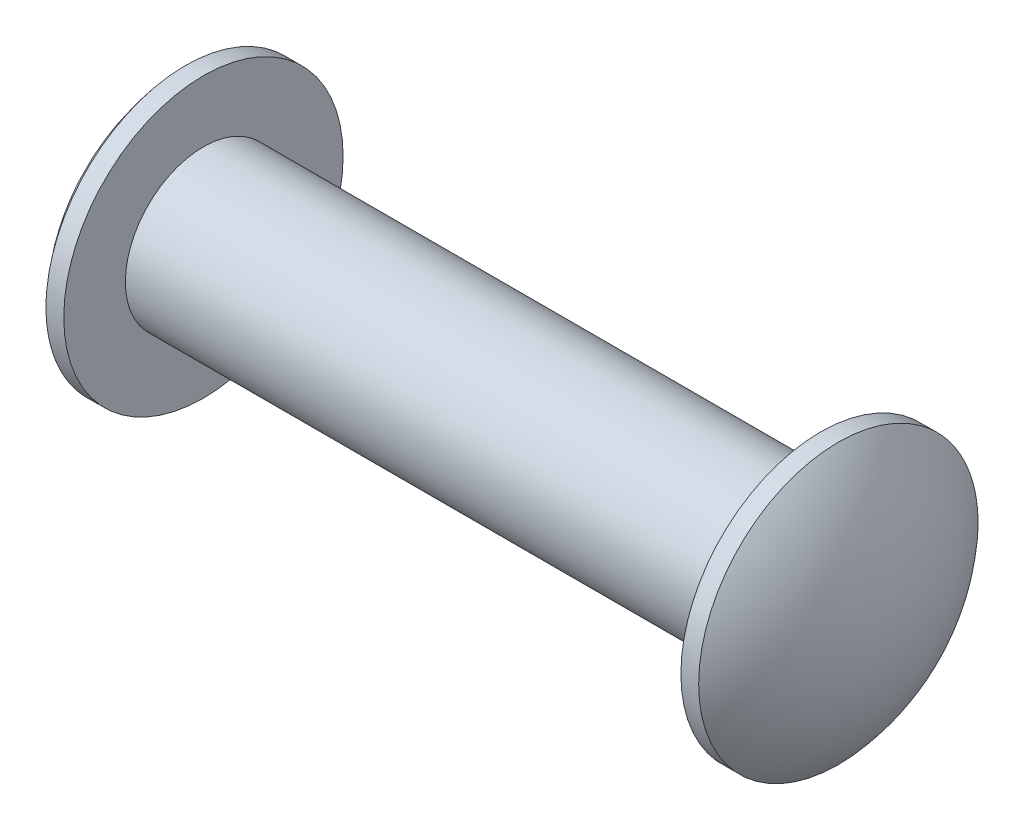
ISO-10303-21;
HEADER;
FILE_DESCRIPTION(('STEP AP214'),'2;1');
FILE_NAME('part.step','',(''),(''),'','','');
FILE_SCHEMA(('AUTOMOTIVE_DESIGN { 1 0 10303 214 1 1 1 1 }'));
ENDSEC;
DATA;
#1=APPLICATION_CONTEXT('core data for automotive mechanical design processes');
#2=APPLICATION_PROTOCOL_DEFINITION('international standard','automotive_design',2000,#1);
#3=PRODUCT_CONTEXT('',#1,'mechanical');
#4=PRODUCT('Part','Part','',(#3));
#5=PRODUCT_RELATED_PRODUCT_CATEGORY('part','',(#4));
#6=PRODUCT_DEFINITION_FORMATION('','',#4);
#7=PRODUCT_DEFINITION_CONTEXT('part definition',#1,'design');
#8=PRODUCT_DEFINITION('design','',#6,#7);
#9=PRODUCT_DEFINITION_SHAPE('','',#8);
#10=(LENGTH_UNIT() NAMED_UNIT(*) SI_UNIT(.MILLI.,.METRE.));
#11=(NAMED_UNIT(*) PLANE_ANGLE_UNIT() SI_UNIT($,.RADIAN.));
#12=(NAMED_UNIT(*) SI_UNIT($,.STERADIAN.) SOLID_ANGLE_UNIT());
#13=UNCERTAINTY_MEASURE_WITH_UNIT(LENGTH_MEASURE(1.E-05),#10,'distance_accuracy_value','');
#14=(GEOMETRIC_REPRESENTATION_CONTEXT(3) GLOBAL_UNCERTAINTY_ASSIGNED_CONTEXT((#13)) GLOBAL_UNIT_ASSIGNED_CONTEXT((#10,
#11,#12)) REPRESENTATION_CONTEXT('',''));
#15=CARTESIAN_POINT('',(0.,0.,0.));
#16=DIRECTION('',(0.,0.,1.));
#17=DIRECTION('',(1.,0.,0.));
#18=AXIS2_PLACEMENT_3D('',#15,#16,#17);
#19=CARTESIAN_POINT('',(-6.50571671396355,12.2385496397778,26.957310777244));
#20=CARTESIAN_POINT('',(-6.30421506841293,12.6542628518713,27.2374280706629));
#21=CARTESIAN_POINT('',(-6.02032466702934,13.0088693621019,27.5299114870223));
#22=CARTESIAN_POINT('',(-5.66442794875693,13.2894005021959,27.8240643236592));
#23=CARTESIAN_POINT('',(-7.52716859000207,11.7157427160591,28.4679707378324));
#24=CARTESIAN_POINT('',(-7.31004589440753,12.1636833418408,28.7698036169812));
#25=CARTESIAN_POINT('',(-7.00414740393423,12.5457800793948,29.0849612803498));
#26=CARTESIAN_POINT('',(-6.62066043729731,12.8480588879324,29.4019177827786));
#27=CARTESIAN_POINT('',(-7.52047984065612,10.6538784165701,30.0390384122937));
#28=CARTESIAN_POINT('',(-7.34289700813513,11.0202452991741,30.2859049937924));
#29=CARTESIAN_POINT('',(-7.09270519721736,11.332759017586,30.5436698045988));
#30=CARTESIAN_POINT('',(-6.77905442209323,11.5799903209935,30.8029058707922));
#31=CARTESIAN_POINT('',(-6.49035451497942,9.45197657428896,31.081724937155));
#32=CARTESIAN_POINT('',(-6.39253944086344,9.653776507688,31.2177024560585));
#33=CARTESIAN_POINT('',(-6.25473033972052,9.82591337528249,31.3596828700185));
#34=CARTESIAN_POINT('',(-6.0819671656019,9.96209178804506,31.5024736717434));
#35=(BOUNDED_SURFACE() B_SPLINE_SURFACE(3,3,((#19,#20,#21,#22),(#23,#24,#25,#26),(#27,#28,#29,
#30),(#31,#32,#33,#34)),.UNSPECIFIED.,.F.,.F.,.F.) B_SPLINE_SURFACE_WITH_KNOTS((4,4),(4,4),
(0.00567292102534701,1.),(0.,1.),
.UNSPECIFIED.) GEOMETRIC_REPRESENTATION_ITEM() RATIONAL_B_SPLINE_SURFACE(((0.997862299274444,
0.985697693559926,0.985697693559926,0.997862299274444),(0.873678966952981,0.863028238729479,
0.863028238729479,0.873678966952981),(0.874391533861499,0.86373211897302,0.86373211897302,
0.874391533861499),(1.,0.98780933429055,0.98780933429055,1.))) REPRESENTATION_ITEM('') SURFACE());
#36=CARTESIAN_POINT('',(-6.30250086372882,9.24452585780372,31.2544639468067));
#37=CARTESIAN_POINT('',(-6.31365133029421,9.25638696178429,31.2448823167673));
#38=CARTESIAN_POINT('',(-6.3248017968596,9.26824806576486,31.235300686728));
#39=CARTESIAN_POINT('',(-6.335952263425,9.28010916974543,31.2257190566887));
#40=CARTESIAN_POINT('',(-7.67599483359704,10.7055548378694,30.0742163757007));
#41=CARTESIAN_POINT('',(-7.59968346818648,11.9477659649434,28.1757957642916));
#42=CARTESIAN_POINT('',(-6.1459181268518,12.3808956303201,26.487239419922));
#43=(BOUNDED_CURVE() B_SPLINE_CURVE(3,(#36,#37,#38,#39,#40,#41,#42),.UNSPECIFIED.,.F.,
.F.) B_SPLINE_CURVE_WITH_KNOTS((4,3,4),(0.,0.00999370626810081,1.00936433307818),
.UNSPECIFIED.) CURVE() GEOMETRIC_REPRESENTATION_ITEM() RATIONAL_B_SPLINE_CURVE((0.999682681999807,
0.999682681999807,0.999682681999807,0.999682681999807,0.831833896158261,0.831939668824992,1.)) REPRESENTATION_ITEM(''));
#44=CARTESIAN_POINT('',(-6.50748000000009,9.47206990151899,31.0642242390293));
#45=VERTEX_POINT('',#44);
#46=CARTESIAN_POINT('',(-6.5074800000001,12.2376459310357,26.9599203580129));
#47=VERTEX_POINT('',#46);
#48=EDGE_CURVE('E35',#45,#47,#43,.T.);
#49=CARTESIAN_POINT('',(-6.50748000000009,9.77900000000008,28.2871340506043));
#50=DIRECTION('',(-1.,0.,0.));
#51=DIRECTION('',(0.,0.,1.));
#52=AXIS2_PLACEMENT_3D('',#49,#50,#51);
#53=CIRCLE('',#52,2.794);
#54=EDGE_CURVE('E43',#47,#45,#53,.F.);
#55=ORIENTED_EDGE('',*,*,#48,.F.);
#56=ORIENTED_EDGE('',*,*,#54,.F.);
#57=EDGE_LOOP('',(#55,#56));
#58=FACE_BOUND('',#57,.T.);
#59=ADVANCED_FACE('F17',(#58),#35,.T.);
#60=CARTESIAN_POINT('',(-5.32611312532229,8.04911584948996,24.963931526257));
#61=CARTESIAN_POINT('',(-6.49495451958349,9.37702114907705,24.9923095777285));
#62=CARTESIAN_POINT('',(-6.80561488960485,11.0198910613385,25.5701626826347));
#63=CARTESIAN_POINT('',(-6.1459181268518,12.3808956303201,26.487239419922));
#64=CARTESIAN_POINT('',(-6.63761478531815,6.86427701276124,26.3881428271578));
#65=CARTESIAN_POINT('',(-8.00928938910914,8.42261844781486,26.4214454229587));
#66=CARTESIAN_POINT('',(-8.37385975943893,10.3505814264067,27.0995754349631));
#67=CARTESIAN_POINT('',(-7.59968346818648,11.9477659649434,28.1757957642916));
#68=CARTESIAN_POINT('',(-6.89679204606631,6.58831369650679,28.6263528535255));
#69=CARTESIAN_POINT('',(-8.00774461514119,7.85045226492812,28.6533254345296));
#70=CARTESIAN_POINT('',(-8.30301901069177,9.41195629673583,29.2025593978331));
#71=CARTESIAN_POINT('',(-7.67599483359704,10.7055548378694,30.0742163757007));
#72=CARTESIAN_POINT('',(-5.97267942117356,7.36060642207548,30.5507092834825));
#73=CARTESIAN_POINT('',(-6.49061763165313,7.94902919520048,30.5632841950729));
#74=CARTESIAN_POINT('',(-6.62827777690962,8.67701941404898,30.8193430620369));
#75=CARTESIAN_POINT('',(-6.335952263425,9.28010916974543,31.2257190566887));
#76=CARTESIAN_POINT('',(-5.96498989909726,7.36703265390335,30.5667218136139));
#77=CARTESIAN_POINT('',(-6.47799364933989,7.94984945180246,30.5791769224942));
#78=CARTESIAN_POINT('',(-6.61434228967314,8.67090401941863,30.8327962855333));
#79=CARTESIAN_POINT('',(-6.3248017968596,9.26824806576486,31.235300686728));
#80=CARTESIAN_POINT('',(-5.95730037702096,7.37345888573123,30.5827343437452));
#81=CARTESIAN_POINT('',(-6.46536966702666,7.95066970840444,30.5950696499156));
#82=CARTESIAN_POINT('',(-6.60040680243666,8.66478862478827,30.8462495090297));
#83=CARTESIAN_POINT('',(-6.31365133029421,9.25638696178429,31.2448823167673));
#84=CARTESIAN_POINT('',(-5.94961085494466,7.37988511755911,30.5987468738765));
#85=CARTESIAN_POINT('',(-6.45274568471342,7.95148996500643,30.6109623773369));
#86=CARTESIAN_POINT('',(-6.58647131520018,8.65867323015792,30.8597027325261));
#87=CARTESIAN_POINT('',(-6.30250086372882,9.24452585780372,31.2544639468067));
#88=(BOUNDED_SURFACE() B_SPLINE_SURFACE(3,3,((#60,#61,#62,#63),(#64,#65,#66,#67),(#68,#69,#70,
#71),(#72,#73,#74,#75),(#76,#77,#78,#79),(#80,#81,#82,#83),(#84,#85,#86,#87)),.UNSPECIFIED.,.F.,
.F.,.F.) B_SPLINE_SURFACE_WITH_KNOTS((4,3,4),(4,4),(0.,0.999370626810078,1.00936433307818),
(0.00204261581303032,1.),
.UNSPECIFIED.) GEOMETRIC_REPRESENTATION_ITEM() RATIONAL_B_SPLINE_SURFACE(((0.999256721200934,
0.878456988445464,0.878704748045153,1.),(0.831321305707053,0.73082321604432,0.731029337083633,
0.831939668824992),(0.831215611658903,0.730730299306043,0.730936394139163,0.831833896158261),
(0.998939639056484,0.878178238230636,0.878425919211743,0.999682681999807),(0.998939639056484,
0.878178238230636,0.878425919211743,0.999682681999807),(0.998939639056484,0.878178238230636,
0.878425919211743,0.999682681999807),(0.998939639056484,0.878178238230636,0.878425919211743,0.999682681999807))) REPRESENTATION_ITEM('') SURFACE());
#89=CARTESIAN_POINT('',(-6.50748000000009,9.77900000000008,28.2871340506043));
#90=DIRECTION('',(-1.,0.,0.));
#91=DIRECTION('',(0.,0.,1.));
#92=AXIS2_PLACEMENT_3D('',#89,#90,#91);
#93=CIRCLE('',#92,2.794);
#94=EDGE_CURVE('E41',#45,#47,#93,.F.);
#95=ORIENTED_EDGE('',*,*,#48,.T.);
#96=ORIENTED_EDGE('',*,*,#94,.F.);
#97=EDGE_LOOP('',(#95,#96));
#98=FACE_BOUND('',#97,.T.);
#99=ADVANCED_FACE('F48',(#98),#88,.T.);
#100=CARTESIAN_POINT('',(6.00779738164856,12.1870551706552,26.0060428972323));
#101=CARTESIAN_POINT('',(6.71365184300076,11.3817900150889,25.9874230725782));
#102=CARTESIAN_POINT('',(6.71400617378348,10.4020532251657,25.5544269829361));
#103=CARTESIAN_POINT('',(6.00814327232882,9.84594769319369,24.9711476804525));
#104=CARTESIAN_POINT('',(6.93938179301908,12.959407897411,27.9187501804881));
#105=CARTESIAN_POINT('',(8.46128030924381,11.2231691789135,27.878603825871));
#106=CARTESIAN_POINT('',(8.46204428471184,9.11075075767336,26.9450174529874));
#107=CARTESIAN_POINT('',(6.94012757071387,7.91172711992344,25.6874042287347));
#108=CARTESIAN_POINT('',(6.69379464723545,12.6924734662792,30.1531543428263));
#109=CARTESIAN_POINT('',(8.57930525351398,10.541412483002,30.103416218617));
#110=CARTESIAN_POINT('',(8.5802517580493,7.924294918536,28.9467773302924));
#111=CARTESIAN_POINT('',(6.69471860618439,6.4388004771824,27.3886950747115));
#112=CARTESIAN_POINT('',(5.39354051068146,11.5195574298721,31.5880889805934));
#113=CARTESIAN_POINT('',(7.00745967386534,9.67833811743325,31.5455152016208));
#114=CARTESIAN_POINT('',(7.00826984263475,7.43819363055951,30.5554801095164));
#115=CARTESIAN_POINT('',(5.39433138136059,6.16667177450608,29.2218260840628));
#116=(BOUNDED_SURFACE() B_SPLINE_SURFACE(3,3,((#100,#101,#102,#103),(#104,#105,#106,#107),(#108,
#109,#110,#111),(#112,#113,#114,#115)),.UNSPECIFIED.,.F.,.F.,
.F.) B_SPLINE_SURFACE_WITH_KNOTS((4,4),(4,4),(0.00383492580180905,0.994911638318778),
(0.00468894360581752,0.994160868572817),
.UNSPECIFIED.) GEOMETRIC_REPRESENTATION_ITEM() RATIONAL_B_SPLINE_SURFACE(((0.995158660264357,
0.792519271023859,0.792283991238939,0.994452820909598),(0.828575211516096,0.659856411684885,
0.659660516291177,0.82798752533497),(0.828364795988648,0.659688842062991,0.659492996416646,
0.827777259049614),(0.994527413682012,0.792016562158176,0.791781431615348,0.993822022053529))) REPRESENTATION_ITEM('') SURFACE());
#117=CARTESIAN_POINT('',(6.54812000000002,9.77900000000008,28.2871340506043));
#118=DIRECTION('',(-1.,0.,0.));
#119=DIRECTION('',(0.,0.,1.));
#120=AXIS2_PLACEMENT_3D('',#117,#118,#119);
#121=CIRCLE('',#120,2.794);
#122=CARTESIAN_POINT('',(6.54812000000002,9.77900000000008,31.0811340506043));
#123=VERTEX_POINT('',#122);
#124=EDGE_CURVE('E45',#123,#123,#121,.T.);
#125=ORIENTED_EDGE('',*,*,#124,.F.);
#126=EDGE_LOOP('',(#125));
#127=FACE_BOUND('',#126,.T.);
#128=ADVANCED_FACE('F63',(#127),#116,.T.);
#129=CARTESIAN_POINT('',(-2.51968000000003,9.77900000000008,28.2871340506043));
#130=DIRECTION('',(-1.,0.,0.));
#131=DIRECTION('',(0.,0.,1.));
#132=AXIS2_PLACEMENT_3D('',#129,#130,#131);
#133=CYLINDRICAL_SURFACE('',#132,2.794);
#134=CARTESIAN_POINT('',(-6.15188000000008,9.77900000000008,28.2871340506043));
#135=DIRECTION('',(-1.,0.,0.));
#136=DIRECTION('',(0.,0.,1.));
#137=AXIS2_PLACEMENT_3D('',#134,#135,#136);
#138=CIRCLE('',#137,2.794);
#139=CARTESIAN_POINT('',(-6.15188000000008,9.77900000000008,31.0811340506043));
#140=VERTEX_POINT('',#139);
#141=EDGE_CURVE('E108',#140,#140,#138,.T.);
#142=ORIENTED_EDGE('',*,*,#141,.T.);
#143=EDGE_LOOP('',(#142));
#144=FACE_BOUND('',#143,.T.);
#145=ORIENTED_EDGE('',*,*,#54,.T.);
#146=ORIENTED_EDGE('',*,*,#94,.T.);
#147=EDGE_LOOP('',(#145,#146));
#148=FACE_BOUND('',#147,.T.);
#149=ADVANCED_FACE('F42',(#144,#148),#133,.T.);
#150=CARTESIAN_POINT('',(2.56031999999997,9.77900000000008,28.2871340506043));
#151=DIRECTION('',(-1.,0.,0.));
#152=DIRECTION('',(0.,0.,1.));
#153=AXIS2_PLACEMENT_3D('',#150,#151,#152);
#154=CYLINDRICAL_SURFACE('',#153,2.794);
#155=ORIENTED_EDGE('',*,*,#124,.T.);
#156=EDGE_LOOP('',(#155));
#157=FACE_BOUND('',#156,.T.);
#158=CARTESIAN_POINT('',(6.19252000000001,9.77900000000008,28.2871340506043));
#159=DIRECTION('',(-1.,0.,0.));
#160=DIRECTION('',(0.,0.,1.));
#161=AXIS2_PLACEMENT_3D('',#158,#159,#160);
#162=CIRCLE('',#161,2.794);
#163=CARTESIAN_POINT('',(6.19252000000001,9.77900000000008,31.0811340506043));
#164=VERTEX_POINT('',#163);
#165=EDGE_CURVE('E106',#164,#164,#162,.F.);
#166=ORIENTED_EDGE('',*,*,#165,.T.);
#167=EDGE_LOOP('',(#166));
#168=FACE_BOUND('',#167,.T.);
#169=ADVANCED_FACE('F81',(#157,#168),#154,.T.);
#170=CARTESIAN_POINT('',(-6.15188000000008,9.77900000000008,28.2871340506043));
#171=DIRECTION('',(-1.,0.,0.));
#172=DIRECTION('',(0.,0.,1.));
#173=AXIS2_PLACEMENT_3D('',#170,#171,#172);
#174=PLANE('',#173);
#175=CARTESIAN_POINT('',(-6.15188000000008,9.77900000000008,28.2871340506043));
#176=DIRECTION('',(-1.,0.,0.));
#177=DIRECTION('',(0.,0.,1.));
#178=AXIS2_PLACEMENT_3D('',#175,#176,#177);
#179=CIRCLE('',#178,1.5621);
#180=CARTESIAN_POINT('',(-6.15188000000008,9.77900000000008,29.8492340506043));
#181=VERTEX_POINT('',#180);
#182=EDGE_CURVE('E28',#181,#181,#179,.F.);
#183=ORIENTED_EDGE('',*,*,#182,.F.);
#184=EDGE_LOOP('',(#183));
#185=FACE_BOUND('',#184,.T.);
#186=ORIENTED_EDGE('',*,*,#141,.F.);
#187=EDGE_LOOP('',(#186));
#188=FACE_BOUND('',#187,.T.);
#189=ADVANCED_FACE('F85',(#185,#188),#174,.F.);
#190=CARTESIAN_POINT('',(6.19252000000001,9.77900000000009,28.2871340506043));
#191=DIRECTION('',(1.,0.,0.));
#192=DIRECTION('',(0.,0.,-1.));
#193=AXIS2_PLACEMENT_3D('',#190,#191,#192);
#194=PLANE('',#193);
#195=CARTESIAN_POINT('',(6.19251999999992,9.77900000000008,28.2871340506043));
#196=DIRECTION('',(-1.,0.,0.));
#197=DIRECTION('',(0.,0.,1.));
#198=AXIS2_PLACEMENT_3D('',#195,#196,#197);
#199=CIRCLE('',#198,1.5621);
#200=CARTESIAN_POINT('',(6.19251999999992,9.77900000000008,29.8492340506043));
#201=VERTEX_POINT('',#200);
#202=EDGE_CURVE('E11',#201,#201,#199,.T.);
#203=ORIENTED_EDGE('',*,*,#202,.F.);
#204=EDGE_LOOP('',(#203));
#205=FACE_BOUND('',#204,.T.);
#206=ORIENTED_EDGE('',*,*,#165,.F.);
#207=EDGE_LOOP('',(#206));
#208=FACE_BOUND('',#207,.T.);
#209=ADVANCED_FACE('F89',(#205,#208),#194,.F.);
#210=CARTESIAN_POINT('',(0.0203199999999224,9.77900000000008,28.2871340506043));
#211=DIRECTION('',(-1.,0.,0.));
#212=DIRECTION('',(0.,0.,1.));
#213=AXIS2_PLACEMENT_3D('',#210,#211,#212);
#214=CYLINDRICAL_SURFACE('',#213,1.5621);
#215=ORIENTED_EDGE('',*,*,#182,.T.);
#216=EDGE_LOOP('',(#215));
#217=FACE_BOUND('',#216,.T.);
#218=ORIENTED_EDGE('',*,*,#202,.T.);
#219=EDGE_LOOP('',(#218));
#220=FACE_BOUND('',#219,.T.);
#221=ADVANCED_FACE('F93',(#217,#220),#214,.T.);
#222=CLOSED_SHELL('',(#59,#99,#128,#149,#169,#189,#209,#221));
#223=MANIFOLD_SOLID_BREP('B1',#222);
#224=ADVANCED_BREP_SHAPE_REPRESENTATION('',(#18,#223),#14);
#225=SHAPE_DEFINITION_REPRESENTATION(#9,#224);
ENDSEC;
END-ISO-10303-21;
